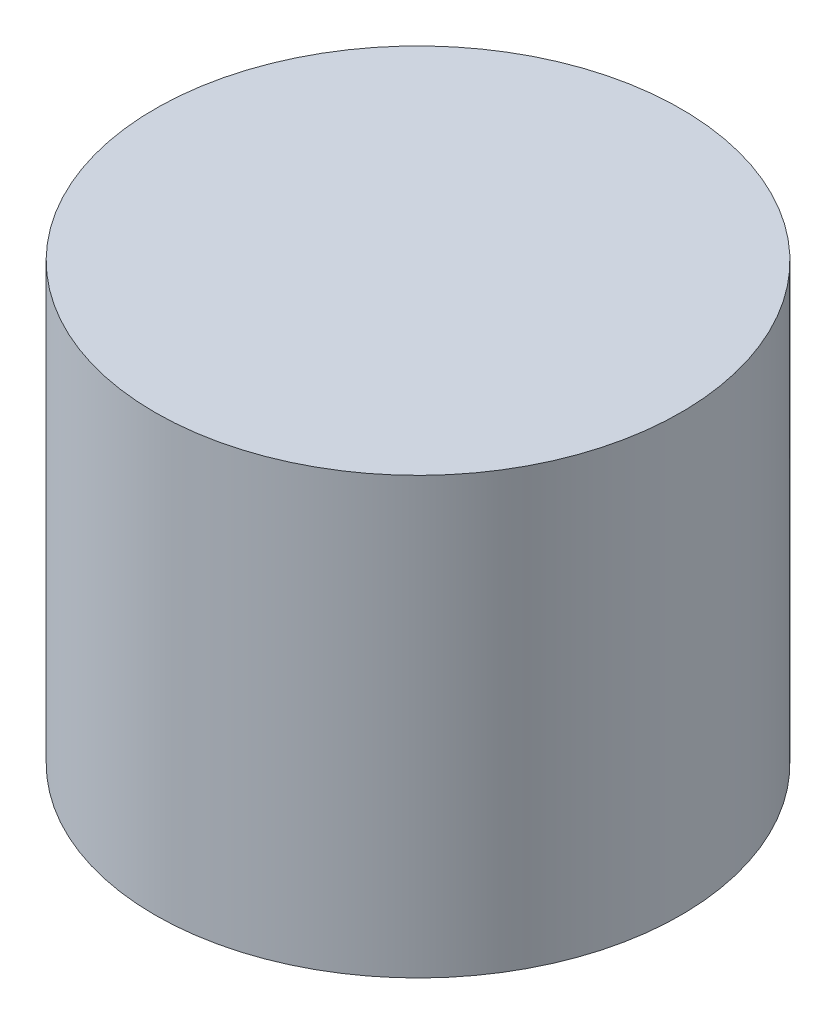
ISO-10303-21;
HEADER;
FILE_DESCRIPTION(('STEP AP214'),'2;1');
FILE_NAME('part.step','',(''),(''),'','','');
FILE_SCHEMA(('AUTOMOTIVE_DESIGN { 1 0 10303 214 1 1 1 1 }'));
ENDSEC;
DATA;
#1=APPLICATION_CONTEXT('core data for automotive mechanical design processes');
#2=APPLICATION_PROTOCOL_DEFINITION('international standard','automotive_design',2000,#1);
#3=PRODUCT_CONTEXT('',#1,'mechanical');
#4=PRODUCT('Part','Part','',(#3));
#5=PRODUCT_RELATED_PRODUCT_CATEGORY('part','',(#4));
#6=PRODUCT_DEFINITION_FORMATION('','',#4);
#7=PRODUCT_DEFINITION_CONTEXT('part definition',#1,'design');
#8=PRODUCT_DEFINITION('design','',#6,#7);
#9=PRODUCT_DEFINITION_SHAPE('','',#8);
#10=(LENGTH_UNIT() NAMED_UNIT(*) SI_UNIT(.MILLI.,.METRE.));
#11=(NAMED_UNIT(*) PLANE_ANGLE_UNIT() SI_UNIT($,.RADIAN.));
#12=(NAMED_UNIT(*) SI_UNIT($,.STERADIAN.) SOLID_ANGLE_UNIT());
#13=UNCERTAINTY_MEASURE_WITH_UNIT(LENGTH_MEASURE(1.E-05),#10,'distance_accuracy_value','');
#14=(GEOMETRIC_REPRESENTATION_CONTEXT(3) GLOBAL_UNCERTAINTY_ASSIGNED_CONTEXT((#13)) GLOBAL_UNIT_ASSIGNED_CONTEXT((#10,
#11,#12)) REPRESENTATION_CONTEXT('',''));
#15=CARTESIAN_POINT('',(0.,0.,0.));
#16=DIRECTION('',(0.,0.,1.));
#17=DIRECTION('',(1.,0.,0.));
#18=AXIS2_PLACEMENT_3D('',#15,#16,#17);
#19=CARTESIAN_POINT('',(0.,240.,0.));
#20=DIRECTION('',(0.,-1.,0.));
#21=DIRECTION('',(0.,0.,-1.));
#22=AXIS2_PLACEMENT_3D('',#19,#20,#21);
#23=CYLINDRICAL_SURFACE('',#22,145.);
#24=CARTESIAN_POINT('',(0.,240.,0.));
#25=DIRECTION('',(0.,1.,0.));
#26=DIRECTION('',(0.,0.,1.));
#27=AXIS2_PLACEMENT_3D('',#24,#25,#26);
#28=CIRCLE('',#27,145.);
#29=CARTESIAN_POINT('',(0.,240.,145.));
#30=VERTEX_POINT('',#29);
#31=EDGE_CURVE('E10',#30,#30,#28,.T.);
#32=ORIENTED_EDGE('',*,*,#31,.F.);
#33=EDGE_LOOP('',(#32));
#34=FACE_BOUND('',#33,.T.);
#35=CARTESIAN_POINT('',(0.,0.,0.));
#36=DIRECTION('',(0.,1.,0.));
#37=DIRECTION('',(0.,0.,1.));
#38=AXIS2_PLACEMENT_3D('',#35,#36,#37);
#39=CIRCLE('',#38,145.);
#40=CARTESIAN_POINT('',(0.,0.,145.));
#41=VERTEX_POINT('',#40);
#42=EDGE_CURVE('E37',#41,#41,#39,.T.);
#43=ORIENTED_EDGE('',*,*,#42,.T.);
#44=EDGE_LOOP('',(#43));
#45=FACE_BOUND('',#44,.T.);
#46=ADVANCED_FACE('F34',(#34,#45),#23,.T.);
#47=CARTESIAN_POINT('',(0.,240.,0.));
#48=DIRECTION('',(0.,1.,0.));
#49=DIRECTION('',(0.,0.,1.));
#50=AXIS2_PLACEMENT_3D('',#47,#48,#49);
#51=PLANE('',#50);
#52=ORIENTED_EDGE('',*,*,#31,.T.);
#53=EDGE_LOOP('',(#52));
#54=FACE_BOUND('',#53,.T.);
#55=ADVANCED_FACE('F49',(#54),#51,.T.);
#56=CARTESIAN_POINT('',(0.,0.,0.));
#57=DIRECTION('',(0.,1.,0.));
#58=DIRECTION('',(0.,0.,1.));
#59=AXIS2_PLACEMENT_3D('',#56,#57,#58);
#60=PLANE('',#59);
#61=ORIENTED_EDGE('',*,*,#42,.F.);
#62=EDGE_LOOP('',(#61));
#63=FACE_BOUND('',#62,.T.);
#64=ADVANCED_FACE('F47',(#63),#60,.F.);
#65=CLOSED_SHELL('',(#46,#55,#64));
#66=MANIFOLD_SOLID_BREP('B2',#65);
#67=ADVANCED_BREP_SHAPE_REPRESENTATION('',(#18,#66),#14);
#68=SHAPE_DEFINITION_REPRESENTATION(#9,#67);
ENDSEC;
END-ISO-10303-21;
